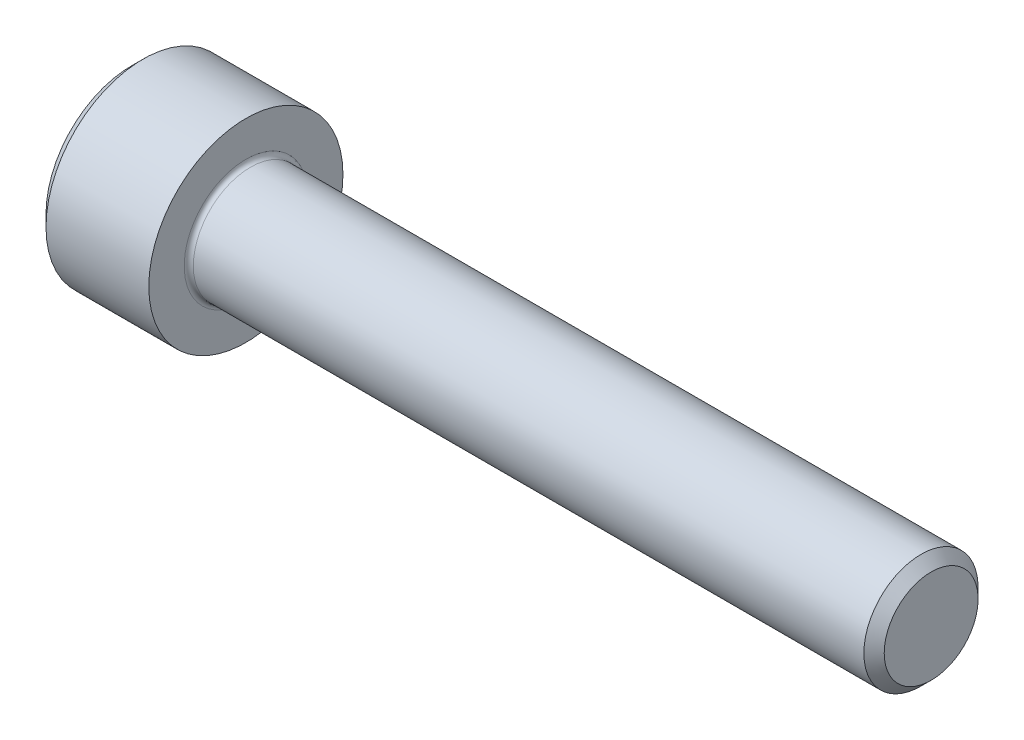
ISO-10303-21;
HEADER;
FILE_DESCRIPTION(('STEP AP214'),'2;1');
FILE_NAME('part.step','',(''),(''),'','','');
FILE_SCHEMA(('AUTOMOTIVE_DESIGN { 1 0 10303 214 1 1 1 1 }'));
ENDSEC;
DATA;
#1=APPLICATION_CONTEXT('core data for automotive mechanical design processes');
#2=APPLICATION_PROTOCOL_DEFINITION('international standard','automotive_design',2000,#1);
#3=PRODUCT_CONTEXT('',#1,'mechanical');
#4=PRODUCT('Part','Part','',(#3));
#5=PRODUCT_RELATED_PRODUCT_CATEGORY('part','',(#4));
#6=PRODUCT_DEFINITION_FORMATION('','',#4);
#7=PRODUCT_DEFINITION_CONTEXT('part definition',#1,'design');
#8=PRODUCT_DEFINITION('design','',#6,#7);
#9=PRODUCT_DEFINITION_SHAPE('','',#8);
#10=(LENGTH_UNIT() NAMED_UNIT(*) SI_UNIT(.MILLI.,.METRE.));
#11=(NAMED_UNIT(*) PLANE_ANGLE_UNIT() SI_UNIT($,.RADIAN.));
#12=(NAMED_UNIT(*) SI_UNIT($,.STERADIAN.) SOLID_ANGLE_UNIT());
#13=UNCERTAINTY_MEASURE_WITH_UNIT(LENGTH_MEASURE(1.E-05),#10,'distance_accuracy_value','');
#14=(GEOMETRIC_REPRESENTATION_CONTEXT(3) GLOBAL_UNCERTAINTY_ASSIGNED_CONTEXT((#13)) GLOBAL_UNIT_ASSIGNED_CONTEXT((#10,
#11,#12)) REPRESENTATION_CONTEXT('',''));
#15=CARTESIAN_POINT('',(0.,0.,0.));
#16=DIRECTION('',(0.,0.,1.));
#17=DIRECTION('',(1.,0.,0.));
#18=AXIS2_PLACEMENT_3D('',#15,#16,#17);
#19=CARTESIAN_POINT('',(0.,0.,0.));
#20=DIRECTION('',(-1.,0.,0.));
#21=DIRECTION('',(0.,0.,1.));
#22=AXIS2_PLACEMENT_3D('',#19,#20,#21);
#23=PLANE('',#22);
#24=DIRECTION('',(0.,-0.499999999999999,0.866025403784439));
#25=VECTOR('',#24,1.);
#26=CARTESIAN_POINT('',(0.,2.35789849937043,0.));
#27=LINE('',#26,#25);
#28=CARTESIAN_POINT('',(0.,2.35789849937043,0.));
#29=VERTEX_POINT('',#28);
#30=CARTESIAN_POINT('',(0.,1.17894924968522,2.042));
#31=VERTEX_POINT('',#30);
#32=EDGE_CURVE('E391',#29,#31,#27,.T.);
#33=ORIENTED_EDGE('',*,*,#32,.T.);
#34=DIRECTION('',(0.,1.,0.));
#35=VECTOR('',#34,1.);
#36=CARTESIAN_POINT('',(0.,-1.17894924968522,2.042));
#37=LINE('',#36,#35);
#38=CARTESIAN_POINT('',(0.,-1.17894924968522,2.042));
#39=VERTEX_POINT('',#38);
#40=EDGE_CURVE('E127',#39,#31,#37,.T.);
#41=ORIENTED_EDGE('',*,*,#40,.F.);
#42=DIRECTION('',(0.,-0.500000000000001,-0.866025403784438));
#43=VECTOR('',#42,1.);
#44=CARTESIAN_POINT('',(0.,-1.17894924968522,2.042));
#45=LINE('',#44,#43);
#46=CARTESIAN_POINT('',(0.,-2.35789849937043,0.));
#47=VERTEX_POINT('',#46);
#48=EDGE_CURVE('E394',#39,#47,#45,.T.);
#49=ORIENTED_EDGE('',*,*,#48,.T.);
#50=DIRECTION('',(0.,0.499999999999999,-0.866025403784439));
#51=VECTOR('',#50,1.);
#52=CARTESIAN_POINT('',(0.,-2.35789849937043,0.));
#53=LINE('',#52,#51);
#54=CARTESIAN_POINT('',(0.,-1.17894924968522,-2.042));
#55=VERTEX_POINT('',#54);
#56=EDGE_CURVE('E397',#47,#55,#53,.T.);
#57=ORIENTED_EDGE('',*,*,#56,.T.);
#58=DIRECTION('',(0.,-1.,0.));
#59=VECTOR('',#58,1.);
#60=CARTESIAN_POINT('',(0.,1.17894924968521,-2.042));
#61=LINE('',#60,#59);
#62=CARTESIAN_POINT('',(0.,1.17894924968521,-2.042));
#63=VERTEX_POINT('',#62);
#64=EDGE_CURVE('E400',#63,#55,#61,.T.);
#65=ORIENTED_EDGE('',*,*,#64,.F.);
#66=DIRECTION('',(0.,-0.500000000000001,-0.866025403784438));
#67=VECTOR('',#66,1.);
#68=CARTESIAN_POINT('',(0.,2.35789849937043,0.));
#69=LINE('',#68,#67);
#70=EDGE_CURVE('E122',#29,#63,#69,.T.);
#71=ORIENTED_EDGE('',*,*,#70,.F.);
#72=EDGE_LOOP('',(#33,#41,#49,#57,#65,#71));
#73=FACE_BOUND('',#72,.T.);
#74=CARTESIAN_POINT('',(0.,0.,0.));
#75=DIRECTION('',(-1.,0.,0.));
#76=DIRECTION('',(0.,0.,1.));
#77=AXIS2_PLACEMENT_3D('',#74,#75,#76);
#78=CIRCLE('',#77,3.75);
#79=CARTESIAN_POINT('',(0.,0.,3.75));
#80=VERTEX_POINT('',#79);
#81=EDGE_CURVE('E138',#80,#80,#78,.T.);
#82=ORIENTED_EDGE('',*,*,#81,.T.);
#83=EDGE_LOOP('',(#82));
#84=FACE_BOUND('',#83,.T.);
#85=ADVANCED_FACE('F35',(#73,#84),#23,.T.);
#86=CARTESIAN_POINT('',(35.,2.055,0.));
#87=DIRECTION('',(1.,0.,0.));
#88=DIRECTION('',(0.,0.,-1.));
#89=AXIS2_PLACEMENT_3D('',#86,#87,#88);
#90=PLANE('',#89);
#91=CARTESIAN_POINT('',(35.,0.,0.));
#92=DIRECTION('',(-1.,0.,0.));
#93=DIRECTION('',(0.,0.,1.));
#94=AXIS2_PLACEMENT_3D('',#91,#92,#93);
#95=CIRCLE('',#94,2.055);
#96=CARTESIAN_POINT('',(35.,0.,2.055));
#97=VERTEX_POINT('',#96);
#98=EDGE_CURVE('E151',#97,#97,#95,.T.);
#99=ORIENTED_EDGE('',*,*,#98,.F.);
#100=EDGE_LOOP('',(#99));
#101=FACE_BOUND('',#100,.T.);
#102=ADVANCED_FACE('F172',(#101),#90,.T.);
#103=CARTESIAN_POINT('',(35.,0.,0.));
#104=DIRECTION('',(-1.,0.,0.));
#105=DIRECTION('',(0.,0.,1.));
#106=AXIS2_PLACEMENT_3D('',#103,#104,#105);
#107=CONICAL_SURFACE('',#106,2.055,0.785398163396863);
#108=CARTESIAN_POINT('',(34.5549999999997,0.,0.));
#109=DIRECTION('',(-1.,0.,0.));
#110=DIRECTION('',(0.,0.,1.));
#111=AXIS2_PLACEMENT_3D('',#108,#109,#110);
#112=CIRCLE('',#111,2.49999999999973);
#113=CARTESIAN_POINT('',(34.5549999999997,0.,2.49999999999973));
#114=VERTEX_POINT('',#113);
#115=EDGE_CURVE('E148',#114,#114,#112,.T.);
#116=ORIENTED_EDGE('',*,*,#115,.F.);
#117=EDGE_LOOP('',(#116));
#118=FACE_BOUND('',#117,.T.);
#119=ORIENTED_EDGE('',*,*,#98,.T.);
#120=EDGE_LOOP('',(#119));
#121=FACE_BOUND('',#120,.T.);
#122=ADVANCED_FACE('F178',(#118,#121),#107,.T.);
#123=CARTESIAN_POINT('',(-31.75,0.,0.));
#124=DIRECTION('',(-1.,0.,0.));
#125=DIRECTION('',(0.,0.,1.));
#126=AXIS2_PLACEMENT_3D('',#123,#124,#125);
#127=CYLINDRICAL_SURFACE('',#126,2.49999999999986);
#128=CARTESIAN_POINT('',(5.2,0.,0.));
#129=DIRECTION('',(1.,0.,0.));
#130=DIRECTION('',(0.,0.,-1.));
#131=AXIS2_PLACEMENT_3D('',#128,#129,#130);
#132=CIRCLE('',#131,2.49999999999986);
#133=CARTESIAN_POINT('',(5.2,0.,-2.49999999999986));
#134=VERTEX_POINT('',#133);
#135=EDGE_CURVE('E11',#134,#134,#132,.T.);
#136=ORIENTED_EDGE('',*,*,#135,.T.);
#137=EDGE_LOOP('',(#136));
#138=FACE_BOUND('',#137,.T.);
#139=ORIENTED_EDGE('',*,*,#115,.T.);
#140=EDGE_LOOP('',(#139));
#141=FACE_BOUND('',#140,.T.);
#142=ADVANCED_FACE('F189',(#138,#141),#127,.T.);
#143=CARTESIAN_POINT('',(5.,4.25,0.));
#144=DIRECTION('',(1.,0.,0.));
#145=DIRECTION('',(0.,0.,-1.));
#146=AXIS2_PLACEMENT_3D('',#143,#144,#145);
#147=PLANE('',#146);
#148=CARTESIAN_POINT('',(5.,0.,0.));
#149=DIRECTION('',(1.,0.,0.));
#150=DIRECTION('',(0.,0.,-1.));
#151=AXIS2_PLACEMENT_3D('',#148,#149,#150);
#152=CIRCLE('',#151,2.69999999999987);
#153=CARTESIAN_POINT('',(5.,0.,-2.69999999999987));
#154=VERTEX_POINT('',#153);
#155=EDGE_CURVE('E43',#154,#154,#152,.F.);
#156=ORIENTED_EDGE('',*,*,#155,.T.);
#157=EDGE_LOOP('',(#156));
#158=FACE_BOUND('',#157,.T.);
#159=CARTESIAN_POINT('',(5.,0.,0.));
#160=DIRECTION('',(-1.,0.,0.));
#161=DIRECTION('',(0.,0.,1.));
#162=AXIS2_PLACEMENT_3D('',#159,#160,#161);
#163=CIRCLE('',#162,4.25);
#164=CARTESIAN_POINT('',(5.,0.,4.25));
#165=VERTEX_POINT('',#164);
#166=EDGE_CURVE('E145',#165,#165,#163,.T.);
#167=ORIENTED_EDGE('',*,*,#166,.F.);
#168=EDGE_LOOP('',(#167));
#169=FACE_BOUND('',#168,.T.);
#170=ADVANCED_FACE('F156',(#158,#169),#147,.T.);
#171=CARTESIAN_POINT('',(-31.75,0.,0.));
#172=DIRECTION('',(-1.,0.,0.));
#173=DIRECTION('',(0.,0.,1.));
#174=AXIS2_PLACEMENT_3D('',#171,#172,#173);
#175=CYLINDRICAL_SURFACE('',#174,4.25);
#176=ORIENTED_EDGE('',*,*,#166,.T.);
#177=EDGE_LOOP('',(#176));
#178=FACE_BOUND('',#177,.T.);
#179=CARTESIAN_POINT('',(0.5,0.,0.));
#180=DIRECTION('',(-1.,0.,0.));
#181=DIRECTION('',(0.,0.,1.));
#182=AXIS2_PLACEMENT_3D('',#179,#180,#181);
#183=CIRCLE('',#182,4.25);
#184=CARTESIAN_POINT('',(0.5,0.,4.25));
#185=VERTEX_POINT('',#184);
#186=EDGE_CURVE('E142',#185,#185,#183,.T.);
#187=ORIENTED_EDGE('',*,*,#186,.F.);
#188=EDGE_LOOP('',(#187));
#189=FACE_BOUND('',#188,.T.);
#190=ADVANCED_FACE('F167',(#178,#189),#175,.T.);
#191=CARTESIAN_POINT('',(0.,0.,0.));
#192=DIRECTION('',(1.,0.,0.));
#193=DIRECTION('',(0.,0.,-1.));
#194=AXIS2_PLACEMENT_3D('',#191,#192,#193);
#195=CONICAL_SURFACE('',#194,3.75,0.78539816339745);
#196=ORIENTED_EDGE('',*,*,#186,.T.);
#197=EDGE_LOOP('',(#196));
#198=FACE_BOUND('',#197,.T.);
#199=ORIENTED_EDGE('',*,*,#81,.F.);
#200=EDGE_LOOP('',(#199));
#201=FACE_BOUND('',#200,.T.);
#202=ADVANCED_FACE('F160',(#198,#201),#195,.T.);
#203=CARTESIAN_POINT('',(5.2,0.,0.));
#204=DIRECTION('',(1.,0.,0.));
#205=DIRECTION('',(0.,0.,-1.));
#206=AXIS2_PLACEMENT_3D('',#203,#204,#205);
#207=TOROIDAL_SURFACE('',#206,2.69999999999987,0.2);
#208=ORIENTED_EDGE('',*,*,#135,.F.);
#209=EDGE_LOOP('',(#208));
#210=FACE_BOUND('',#209,.T.);
#211=ORIENTED_EDGE('',*,*,#155,.F.);
#212=EDGE_LOOP('',(#211));
#213=FACE_BOUND('',#212,.T.);
#214=ADVANCED_FACE('F37',(#210,#213),#207,.F.);
#215=CARTESIAN_POINT('',(2.5,2.35789849937043,0.));
#216=DIRECTION('',(0.,-0.866025403784439,-0.499999999999999));
#217=DIRECTION('',(0.,0.499999999999999,-0.866025403784439));
#218=AXIS2_PLACEMENT_3D('',#215,#216,#217);
#219=PLANE('',#218);
#220=ORIENTED_EDGE('',*,*,#32,.F.);
#221=DIRECTION('',(-1.,0.,0.));
#222=VECTOR('',#221,1.);
#223=CARTESIAN_POINT('',(2.5,2.35789849937043,0.));
#224=LINE('',#223,#222);
#225=CARTESIAN_POINT('',(2.5,2.35789849937043,0.));
#226=VERTEX_POINT('',#225);
#227=EDGE_CURVE('E390',#226,#29,#224,.T.);
#228=ORIENTED_EDGE('',*,*,#227,.F.);
#229=DIRECTION('',(0.,-0.499999999999999,0.866025403784439));
#230=VECTOR('',#229,1.);
#231=CARTESIAN_POINT('',(2.5,2.35789849937043,0.));
#232=LINE('',#231,#230);
#233=CARTESIAN_POINT('',(2.5,1.76842387452783,1.021));
#234=VERTEX_POINT('',#233);
#235=EDGE_CURVE('E50',#226,#234,#232,.T.);
#236=ORIENTED_EDGE('',*,*,#235,.T.);
#237=CARTESIAN_POINT('',(2.5,1.17894924968522,2.042));
#238=VERTEX_POINT('',#237);
#239=EDGE_CURVE('E108',#234,#238,#232,.T.);
#240=ORIENTED_EDGE('',*,*,#239,.T.);
#241=DIRECTION('',(-1.,0.,0.));
#242=VECTOR('',#241,1.);
#243=CARTESIAN_POINT('',(2.5,1.17894924968522,2.042));
#244=LINE('',#243,#242);
#245=EDGE_CURVE('E120',#238,#31,#244,.T.);
#246=ORIENTED_EDGE('',*,*,#245,.T.);
#247=EDGE_LOOP('',(#220,#228,#236,#240,#246));
#248=FACE_BOUND('',#247,.T.);
#249=ADVANCED_FACE('F119',(#248),#219,.T.);
#250=CARTESIAN_POINT('',(2.5,-1.17894924968522,2.042));
#251=DIRECTION('',(0.,0.,1.));
#252=DIRECTION('',(0.,-1.,0.));
#253=AXIS2_PLACEMENT_3D('',#250,#251,#252);
#254=PLANE('',#253);
#255=ORIENTED_EDGE('',*,*,#40,.T.);
#256=ORIENTED_EDGE('',*,*,#245,.F.);
#257=DIRECTION('',(0.,1.,0.));
#258=VECTOR('',#257,1.);
#259=CARTESIAN_POINT('',(2.5,-1.17894924968522,2.042));
#260=LINE('',#259,#258);
#261=CARTESIAN_POINT('',(2.5,0.,2.042));
#262=VERTEX_POINT('',#261);
#263=EDGE_CURVE('E106',#262,#238,#260,.T.);
#264=ORIENTED_EDGE('',*,*,#263,.F.);
#265=CARTESIAN_POINT('',(2.5,-1.17894924968522,2.042));
#266=VERTEX_POINT('',#265);
#267=EDGE_CURVE('E116',#266,#262,#260,.T.);
#268=ORIENTED_EDGE('',*,*,#267,.F.);
#269=DIRECTION('',(-1.,0.,0.));
#270=VECTOR('',#269,1.);
#271=CARTESIAN_POINT('',(2.5,-1.17894924968522,2.042));
#272=LINE('',#271,#270);
#273=EDGE_CURVE('E129',#266,#39,#272,.T.);
#274=ORIENTED_EDGE('',*,*,#273,.T.);
#275=EDGE_LOOP('',(#255,#256,#264,#268,#274));
#276=FACE_BOUND('',#275,.T.);
#277=ADVANCED_FACE('F124',(#276),#254,.F.);
#278=CARTESIAN_POINT('',(2.5,-1.17894924968522,2.042));
#279=DIRECTION('',(0.,0.866025403784438,-0.500000000000001));
#280=DIRECTION('',(0.,0.500000000000001,0.866025403784438));
#281=AXIS2_PLACEMENT_3D('',#278,#279,#280);
#282=PLANE('',#281);
#283=ORIENTED_EDGE('',*,*,#48,.F.);
#284=ORIENTED_EDGE('',*,*,#273,.F.);
#285=DIRECTION('',(0.,-0.500000000000001,-0.866025403784438));
#286=VECTOR('',#285,1.);
#287=CARTESIAN_POINT('',(2.5,-1.17894924968522,2.042));
#288=LINE('',#287,#286);
#289=CARTESIAN_POINT('',(2.5,-1.76842387452782,1.021));
#290=VERTEX_POINT('',#289);
#291=EDGE_CURVE('E371',#266,#290,#288,.T.);
#292=ORIENTED_EDGE('',*,*,#291,.T.);
#293=CARTESIAN_POINT('',(2.5,-2.35789849937043,0.));
#294=VERTEX_POINT('',#293);
#295=EDGE_CURVE('E373',#290,#294,#288,.T.);
#296=ORIENTED_EDGE('',*,*,#295,.T.);
#297=DIRECTION('',(-1.,0.,0.));
#298=VECTOR('',#297,1.);
#299=CARTESIAN_POINT('',(2.5,-2.35789849937043,0.));
#300=LINE('',#299,#298);
#301=EDGE_CURVE('E134',#294,#47,#300,.T.);
#302=ORIENTED_EDGE('',*,*,#301,.T.);
#303=EDGE_LOOP('',(#283,#284,#292,#296,#302));
#304=FACE_BOUND('',#303,.T.);
#305=ADVANCED_FACE('F263',(#304),#282,.T.);
#306=CARTESIAN_POINT('',(2.5,-2.35789849937043,0.));
#307=DIRECTION('',(0.,0.866025403784439,0.499999999999999));
#308=DIRECTION('',(0.,-0.499999999999999,0.866025403784439));
#309=AXIS2_PLACEMENT_3D('',#306,#307,#308);
#310=PLANE('',#309);
#311=ORIENTED_EDGE('',*,*,#56,.F.);
#312=ORIENTED_EDGE('',*,*,#301,.F.);
#313=DIRECTION('',(0.,0.499999999999999,-0.866025403784439));
#314=VECTOR('',#313,1.);
#315=CARTESIAN_POINT('',(2.5,-2.35789849937043,0.));
#316=LINE('',#315,#314);
#317=CARTESIAN_POINT('',(2.5,-1.76842387452783,-1.021));
#318=VERTEX_POINT('',#317);
#319=EDGE_CURVE('E376',#294,#318,#316,.T.);
#320=ORIENTED_EDGE('',*,*,#319,.T.);
#321=CARTESIAN_POINT('',(2.5,-1.17894924968522,-2.042));
#322=VERTEX_POINT('',#321);
#323=EDGE_CURVE('E380',#318,#322,#316,.T.);
#324=ORIENTED_EDGE('',*,*,#323,.T.);
#325=DIRECTION('',(-1.,0.,0.));
#326=VECTOR('',#325,1.);
#327=CARTESIAN_POINT('',(2.5,-1.17894924968522,-2.042));
#328=LINE('',#327,#326);
#329=EDGE_CURVE('E409',#322,#55,#328,.T.);
#330=ORIENTED_EDGE('',*,*,#329,.T.);
#331=EDGE_LOOP('',(#311,#312,#320,#324,#330));
#332=FACE_BOUND('',#331,.T.);
#333=ADVANCED_FACE('F271',(#332),#310,.T.);
#334=CARTESIAN_POINT('',(2.5,1.17894924968521,-2.042));
#335=DIRECTION('',(0.,0.,-1.));
#336=DIRECTION('',(0.,1.,0.));
#337=AXIS2_PLACEMENT_3D('',#334,#335,#336);
#338=PLANE('',#337);
#339=ORIENTED_EDGE('',*,*,#64,.T.);
#340=ORIENTED_EDGE('',*,*,#329,.F.);
#341=DIRECTION('',(0.,-1.,0.));
#342=VECTOR('',#341,1.);
#343=CARTESIAN_POINT('',(2.5,1.17894924968521,-2.042));
#344=LINE('',#343,#342);
#345=CARTESIAN_POINT('',(2.5,0.,-2.042));
#346=VERTEX_POINT('',#345);
#347=EDGE_CURVE('E384',#346,#322,#344,.T.);
#348=ORIENTED_EDGE('',*,*,#347,.F.);
#349=CARTESIAN_POINT('',(2.5,1.17894924968521,-2.042));
#350=VERTEX_POINT('',#349);
#351=EDGE_CURVE('E385',#350,#346,#344,.T.);
#352=ORIENTED_EDGE('',*,*,#351,.F.);
#353=DIRECTION('',(-1.,0.,0.));
#354=VECTOR('',#353,1.);
#355=CARTESIAN_POINT('',(2.5,1.17894924968521,-2.042));
#356=LINE('',#355,#354);
#357=EDGE_CURVE('E406',#350,#63,#356,.T.);
#358=ORIENTED_EDGE('',*,*,#357,.T.);
#359=EDGE_LOOP('',(#339,#340,#348,#352,#358));
#360=FACE_BOUND('',#359,.T.);
#361=ADVANCED_FACE('F280',(#360),#338,.F.);
#362=CARTESIAN_POINT('',(2.5,2.35789849937043,0.));
#363=DIRECTION('',(0.,0.866025403784438,-0.500000000000001));
#364=DIRECTION('',(0.,0.500000000000001,0.866025403784438));
#365=AXIS2_PLACEMENT_3D('',#362,#363,#364);
#366=PLANE('',#365);
#367=ORIENTED_EDGE('',*,*,#70,.T.);
#368=ORIENTED_EDGE('',*,*,#357,.F.);
#369=DIRECTION('',(0.,-0.500000000000001,-0.866025403784438));
#370=VECTOR('',#369,1.);
#371=CARTESIAN_POINT('',(2.5,2.35789849937043,0.));
#372=LINE('',#371,#370);
#373=CARTESIAN_POINT('',(2.5,1.76842387452782,-1.021));
#374=VERTEX_POINT('',#373);
#375=EDGE_CURVE('E388',#374,#350,#372,.T.);
#376=ORIENTED_EDGE('',*,*,#375,.F.);
#377=EDGE_CURVE('E362',#226,#374,#372,.T.);
#378=ORIENTED_EDGE('',*,*,#377,.F.);
#379=ORIENTED_EDGE('',*,*,#227,.T.);
#380=EDGE_LOOP('',(#367,#368,#376,#378,#379));
#381=FACE_BOUND('',#380,.T.);
#382=ADVANCED_FACE('F289',(#381),#366,.F.);
#383=CARTESIAN_POINT('',(2.5,1.17894924968522,2.042));
#384=DIRECTION('',(-1.,0.,0.));
#385=DIRECTION('',(0.,0.,1.));
#386=AXIS2_PLACEMENT_3D('',#383,#384,#385);
#387=PLANE('',#386);
#388=CARTESIAN_POINT('',(2.5,0.,0.));
#389=DIRECTION('',(-1.,0.,0.));
#390=DIRECTION('',(0.,0.,1.));
#391=AXIS2_PLACEMENT_3D('',#388,#389,#390);
#392=CIRCLE('',#391,2.042);
#393=EDGE_CURVE('E128',#290,#262,#392,.T.);
#394=ORIENTED_EDGE('',*,*,#393,.F.);
#395=ORIENTED_EDGE('',*,*,#291,.F.);
#396=ORIENTED_EDGE('',*,*,#267,.T.);
#397=EDGE_LOOP('',(#394,#395,#396));
#398=FACE_BOUND('',#397,.T.);
#399=ADVANCED_FACE('F298',(#398),#387,.T.);
#400=EDGE_CURVE('E132',#318,#290,#392,.T.);
#401=ORIENTED_EDGE('',*,*,#400,.F.);
#402=ORIENTED_EDGE('',*,*,#319,.F.);
#403=ORIENTED_EDGE('',*,*,#295,.F.);
#404=EDGE_LOOP('',(#401,#402,#403));
#405=FACE_BOUND('',#404,.T.);
#406=ADVANCED_FACE('F307',(#405),#387,.T.);
#407=EDGE_CURVE('E415',#346,#318,#392,.T.);
#408=ORIENTED_EDGE('',*,*,#407,.F.);
#409=ORIENTED_EDGE('',*,*,#347,.T.);
#410=ORIENTED_EDGE('',*,*,#323,.F.);
#411=EDGE_LOOP('',(#408,#409,#410));
#412=FACE_BOUND('',#411,.T.);
#413=ADVANCED_FACE('F316',(#412),#387,.T.);
#414=EDGE_CURVE('E365',#374,#346,#392,.T.);
#415=ORIENTED_EDGE('',*,*,#414,.F.);
#416=ORIENTED_EDGE('',*,*,#375,.T.);
#417=ORIENTED_EDGE('',*,*,#351,.T.);
#418=EDGE_LOOP('',(#415,#416,#417));
#419=FACE_BOUND('',#418,.T.);
#420=ADVANCED_FACE('F324',(#419),#387,.T.);
#421=EDGE_CURVE('E139',#234,#374,#392,.T.);
#422=ORIENTED_EDGE('',*,*,#421,.F.);
#423=ORIENTED_EDGE('',*,*,#235,.F.);
#424=ORIENTED_EDGE('',*,*,#377,.T.);
#425=EDGE_LOOP('',(#422,#423,#424));
#426=FACE_BOUND('',#425,.T.);
#427=ADVANCED_FACE('F332',(#426),#387,.T.);
#428=EDGE_CURVE('E111',#262,#234,#392,.T.);
#429=ORIENTED_EDGE('',*,*,#428,.F.);
#430=ORIENTED_EDGE('',*,*,#263,.T.);
#431=ORIENTED_EDGE('',*,*,#239,.F.);
#432=EDGE_LOOP('',(#429,#430,#431));
#433=FACE_BOUND('',#432,.T.);
#434=ADVANCED_FACE('F107',(#433),#387,.T.);
#435=CARTESIAN_POINT('',(2.5,0.,0.));
#436=DIRECTION('',(-1.,0.,0.));
#437=DIRECTION('',(0.,0.,1.));
#438=AXIS2_PLACEMENT_3D('',#435,#436,#437);
#439=CONICAL_SURFACE('',#438,2.042,1.04719755119659);
#440=CARTESIAN_POINT('',(3.67894924968523,0.,0.));
#441=VERTEX_POINT('',#440);
#442=VERTEX_LOOP('',#441);
#443=FACE_BOUND('',#442,.T.);
#444=ORIENTED_EDGE('',*,*,#428,.T.);
#445=ORIENTED_EDGE('',*,*,#421,.T.);
#446=ORIENTED_EDGE('',*,*,#414,.T.);
#447=ORIENTED_EDGE('',*,*,#407,.T.);
#448=ORIENTED_EDGE('',*,*,#400,.T.);
#449=ORIENTED_EDGE('',*,*,#393,.T.);
#450=EDGE_LOOP('',(#444,#445,#446,#447,#448,#449));
#451=FACE_BOUND('',#450,.T.);
#452=ADVANCED_FACE('F182',(#443,#451),#439,.F.);
#453=CLOSED_SHELL('',(#85,#102,#122,#142,#170,#190,#202,#214,#249,#277,#305,#333,#361,#382,#399,
#406,#413,#420,#427,#434,#452));
#454=MANIFOLD_SOLID_BREP('B2',#453);
#455=ADVANCED_BREP_SHAPE_REPRESENTATION('',(#18,#454),#14);
#456=SHAPE_DEFINITION_REPRESENTATION(#9,#455);
ENDSEC;
END-ISO-10303-21;
